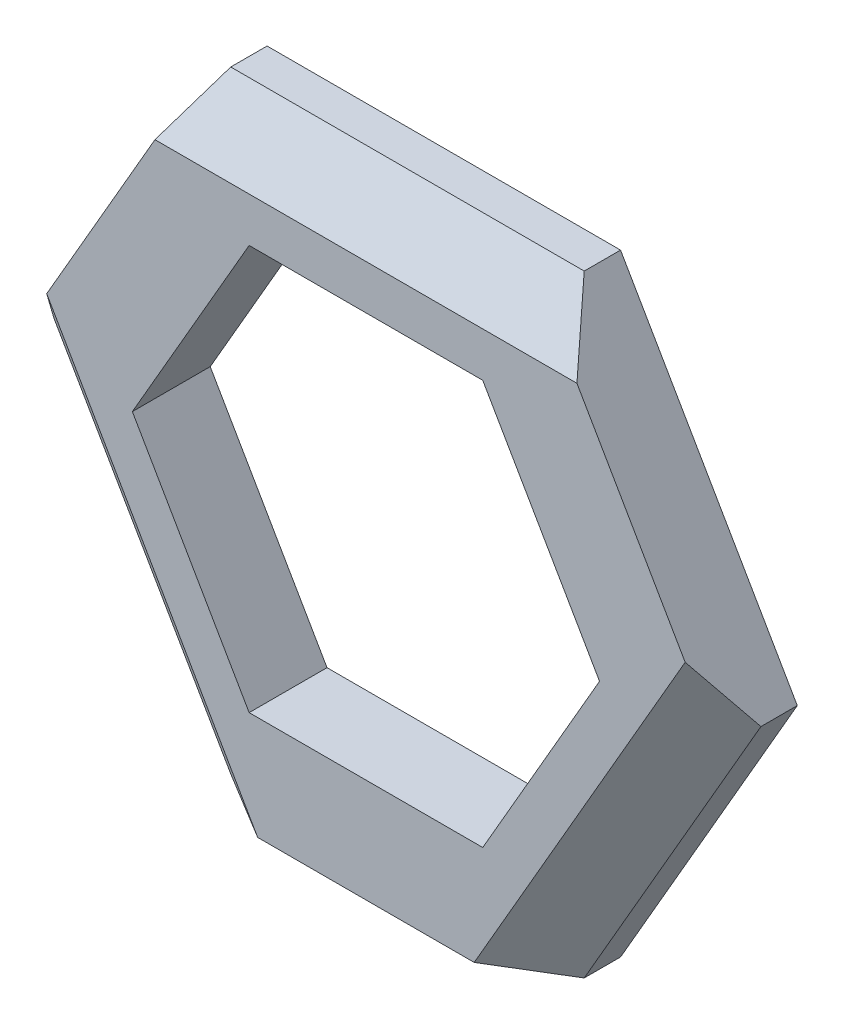
ISO-10303-21;
HEADER;
FILE_DESCRIPTION(('STEP AP214'),'2;1');
FILE_NAME('part.step','',(''),(''),'','','');
FILE_SCHEMA(('AUTOMOTIVE_DESIGN { 1 0 10303 214 1 1 1 1 }'));
ENDSEC;
DATA;
#1=APPLICATION_CONTEXT('core data for automotive mechanical design processes');
#2=APPLICATION_PROTOCOL_DEFINITION('international standard','automotive_design',2000,#1);
#3=PRODUCT_CONTEXT('',#1,'mechanical');
#4=PRODUCT('Part','Part','',(#3));
#5=PRODUCT_RELATED_PRODUCT_CATEGORY('part','',(#4));
#6=PRODUCT_DEFINITION_FORMATION('','',#4);
#7=PRODUCT_DEFINITION_CONTEXT('part definition',#1,'design');
#8=PRODUCT_DEFINITION('design','',#6,#7);
#9=PRODUCT_DEFINITION_SHAPE('','',#8);
#10=(LENGTH_UNIT() NAMED_UNIT(*) SI_UNIT(.MILLI.,.METRE.));
#11=(NAMED_UNIT(*) PLANE_ANGLE_UNIT() SI_UNIT($,.RADIAN.));
#12=(NAMED_UNIT(*) SI_UNIT($,.STERADIAN.) SOLID_ANGLE_UNIT());
#13=UNCERTAINTY_MEASURE_WITH_UNIT(LENGTH_MEASURE(1.E-05),#10,'distance_accuracy_value','');
#14=(GEOMETRIC_REPRESENTATION_CONTEXT(3) GLOBAL_UNCERTAINTY_ASSIGNED_CONTEXT((#13)) GLOBAL_UNIT_ASSIGNED_CONTEXT((#10,
#11,#12)) REPRESENTATION_CONTEXT('',''));
#15=CARTESIAN_POINT('',(0.,0.,0.));
#16=DIRECTION('',(0.,0.,1.));
#17=DIRECTION('',(1.,0.,0.));
#18=AXIS2_PLACEMENT_3D('',#15,#16,#17);
#19=CARTESIAN_POINT('',(0.,0.,15.));
#20=DIRECTION('',(0.,0.,1.));
#21=DIRECTION('',(1.,0.,0.));
#22=AXIS2_PLACEMENT_3D('',#19,#20,#21);
#23=PLANE('',#22);
#24=DIRECTION('',(-0.499999999999999,-0.866025403784439,0.));
#25=VECTOR('',#24,1.);
#26=CARTESIAN_POINT('',(-34.0470053837925,58.9711431702997,15.));
#27=LINE('',#26,#25);
#28=CARTESIAN_POINT('',(-40.643338472874,47.5459591163628,15.));
#29=VERTEX_POINT('',#28);
#30=CARTESIAN_POINT('',(-61.4976776785035,11.4251840539368,15.));
#31=VERTEX_POINT('',#30);
#32=EDGE_CURVE('E199',#29,#31,#27,.T.);
#33=ORIENTED_EDGE('',*,*,#32,.T.);
#34=DIRECTION('',(0.500000000000001,-0.866025403784438,0.));
#35=VECTOR('',#34,1.);
#36=CARTESIAN_POINT('',(-24.1525057501702,-53.2585511433313,15.));
#37=LINE('',#36,#35);
#38=CARTESIAN_POINT('',(-20.8543392056294,-58.9711431702998,15.));
#39=VERTEX_POINT('',#38);
#40=EDGE_CURVE('E240',#31,#39,#37,.T.);
#41=ORIENTED_EDGE('',*,*,#40,.T.);
#42=DIRECTION('',(1.,0.,0.));
#43=VECTOR('',#42,1.);
#44=CARTESIAN_POINT('',(-34.0470053837924,-58.9711431702998,15.));
#45=LINE('',#44,#43);
#46=CARTESIAN_POINT('',(20.8543392056295,-58.9711431702998,15.));
#47=VERTEX_POINT('',#46);
#48=EDGE_CURVE('E203',#39,#47,#45,.T.);
#49=ORIENTED_EDGE('',*,*,#48,.T.);
#50=DIRECTION('',(0.499999999999998,0.86602540378444,0.));
#51=VECTOR('',#50,1.);
#52=CARTESIAN_POINT('',(58.1995111339627,5.71259202696859,15.));
#53=LINE('',#52,#51);
#54=CARTESIAN_POINT('',(61.4976776785034,11.4251840539371,15.));
#55=VERTEX_POINT('',#54);
#56=EDGE_CURVE('E237',#47,#55,#53,.T.);
#57=ORIENTED_EDGE('',*,*,#56,.T.);
#58=DIRECTION('',(-0.500000000000001,0.866025403784438,0.));
#59=VECTOR('',#58,1.);
#60=CARTESIAN_POINT('',(68.094010767585,1.21968236504704E-13,15.));
#61=LINE('',#60,#59);
#62=CARTESIAN_POINT('',(40.643338472874,47.5459591163628,15.));
#63=VERTEX_POINT('',#62);
#64=EDGE_CURVE('E196',#55,#63,#61,.T.);
#65=ORIENTED_EDGE('',*,*,#64,.T.);
#66=DIRECTION('',(-1.,0.,0.));
#67=VECTOR('',#66,1.);
#68=CARTESIAN_POINT('',(-34.0470053837925,47.5459591163628,15.));
#69=LINE('',#68,#67);
#70=EDGE_CURVE('E234',#63,#29,#69,.T.);
#71=ORIENTED_EDGE('',*,*,#70,.T.);
#72=EDGE_LOOP('',(#33,#41,#49,#57,#65,#71));
#73=FACE_BOUND('',#72,.T.);
#74=DIRECTION('',(-0.500000000000001,0.866025403784438,0.));
#75=VECTOR('',#74,1.);
#76=CARTESIAN_POINT('',(45.,0.,15.));
#77=LINE('',#76,#75);
#78=CARTESIAN_POINT('',(45.,0.,15.));
#79=VERTEX_POINT('',#78);
#80=CARTESIAN_POINT('',(22.5,38.9711431702997,15.));
#81=VERTEX_POINT('',#80);
#82=EDGE_CURVE('E150',#79,#81,#77,.T.);
#83=ORIENTED_EDGE('',*,*,#82,.F.);
#84=DIRECTION('',(0.499999999999999,0.866025403784439,0.));
#85=VECTOR('',#84,1.);
#86=CARTESIAN_POINT('',(22.5,-38.9711431702998,15.));
#87=LINE('',#86,#85);
#88=CARTESIAN_POINT('',(22.5,-38.9711431702998,15.));
#89=VERTEX_POINT('',#88);
#90=EDGE_CURVE('E140',#89,#79,#87,.T.);
#91=ORIENTED_EDGE('',*,*,#90,.F.);
#92=DIRECTION('',(1.,0.,0.));
#93=VECTOR('',#92,1.);
#94=CARTESIAN_POINT('',(-22.4999999999999,-38.9711431702998,15.));
#95=LINE('',#94,#93);
#96=CARTESIAN_POINT('',(-22.4999999999999,-38.9711431702998,15.));
#97=VERTEX_POINT('',#96);
#98=EDGE_CURVE('E172',#97,#89,#95,.T.);
#99=ORIENTED_EDGE('',*,*,#98,.F.);
#100=DIRECTION('',(0.500000000000001,-0.866025403784438,0.));
#101=VECTOR('',#100,1.);
#102=CARTESIAN_POINT('',(-44.9999999999999,0.,15.));
#103=LINE('',#102,#101);
#104=CARTESIAN_POINT('',(-44.9999999999999,0.,15.));
#105=VERTEX_POINT('',#104);
#106=EDGE_CURVE('E169',#105,#97,#103,.T.);
#107=ORIENTED_EDGE('',*,*,#106,.F.);
#108=DIRECTION('',(-0.499999999999999,-0.866025403784439,0.));
#109=VECTOR('',#108,1.);
#110=CARTESIAN_POINT('',(-22.5,38.9711431702997,15.));
#111=LINE('',#110,#109);
#112=CARTESIAN_POINT('',(-22.5,38.9711431702997,15.));
#113=VERTEX_POINT('',#112);
#114=EDGE_CURVE('E165',#113,#105,#111,.T.);
#115=ORIENTED_EDGE('',*,*,#114,.F.);
#116=DIRECTION('',(-1.,0.,0.));
#117=VECTOR('',#116,1.);
#118=CARTESIAN_POINT('',(22.5,38.9711431702997,15.));
#119=LINE('',#118,#117);
#120=EDGE_CURVE('E163',#81,#113,#119,.T.);
#121=ORIENTED_EDGE('',*,*,#120,.F.);
#122=EDGE_LOOP('',(#83,#91,#99,#107,#115,#121));
#123=FACE_BOUND('',#122,.T.);
#124=ADVANCED_FACE('F33',(#73,#123),#23,.T.);
#125=CARTESIAN_POINT('',(0.,0.,0.));
#126=DIRECTION('',(0.,0.,1.));
#127=DIRECTION('',(1.,0.,0.));
#128=AXIS2_PLACEMENT_3D('',#125,#126,#127);
#129=PLANE('',#128);
#130=DIRECTION('',(-0.500000000000001,0.866025403784438,0.));
#131=VECTOR('',#130,1.);
#132=CARTESIAN_POINT('',(68.094010767585,1.21968236504704E-13,0.));
#133=LINE('',#132,#131);
#134=CARTESIAN_POINT('',(68.094010767585,1.21968236504704E-13,0.));
#135=VERTEX_POINT('',#134);
#136=CARTESIAN_POINT('',(34.0470053837925,58.9711431702997,0.));
#137=VERTEX_POINT('',#136);
#138=EDGE_CURVE('E158',#135,#137,#133,.T.);
#139=ORIENTED_EDGE('',*,*,#138,.F.);
#140=DIRECTION('',(0.499999999999998,0.86602540378444,0.));
#141=VECTOR('',#140,1.);
#142=CARTESIAN_POINT('',(34.0470053837925,-58.9711431702998,0.));
#143=LINE('',#142,#141);
#144=CARTESIAN_POINT('',(34.0470053837925,-58.9711431702998,0.));
#145=VERTEX_POINT('',#144);
#146=EDGE_CURVE('E200',#145,#135,#143,.T.);
#147=ORIENTED_EDGE('',*,*,#146,.F.);
#148=DIRECTION('',(1.,0.,0.));
#149=VECTOR('',#148,1.);
#150=CARTESIAN_POINT('',(-34.0470053837924,-58.9711431702998,0.));
#151=LINE('',#150,#149);
#152=CARTESIAN_POINT('',(-34.0470053837924,-58.9711431702998,0.));
#153=VERTEX_POINT('',#152);
#154=EDGE_CURVE('E218',#153,#145,#151,.T.);
#155=ORIENTED_EDGE('',*,*,#154,.F.);
#156=DIRECTION('',(0.500000000000001,-0.866025403784438,0.));
#157=VECTOR('',#156,1.);
#158=CARTESIAN_POINT('',(-68.094010767585,-1.17887349479437E-13,0.));
#159=LINE('',#158,#157);
#160=CARTESIAN_POINT('',(-68.094010767585,-1.17887349479437E-13,0.));
#161=VERTEX_POINT('',#160);
#162=EDGE_CURVE('E215',#161,#153,#159,.T.);
#163=ORIENTED_EDGE('',*,*,#162,.F.);
#164=DIRECTION('',(-0.499999999999999,-0.866025403784439,0.));
#165=VECTOR('',#164,1.);
#166=CARTESIAN_POINT('',(-34.0470053837925,58.9711431702997,0.));
#167=LINE('',#166,#165);
#168=CARTESIAN_POINT('',(-34.0470053837925,58.9711431702997,0.));
#169=VERTEX_POINT('',#168);
#170=EDGE_CURVE('E212',#169,#161,#167,.T.);
#171=ORIENTED_EDGE('',*,*,#170,.F.);
#172=DIRECTION('',(-1.,0.,0.));
#173=VECTOR('',#172,1.);
#174=CARTESIAN_POINT('',(34.0470053837925,58.9711431702997,0.));
#175=LINE('',#174,#173);
#176=EDGE_CURVE('E209',#137,#169,#175,.T.);
#177=ORIENTED_EDGE('',*,*,#176,.F.);
#178=EDGE_LOOP('',(#139,#147,#155,#163,#171,#177));
#179=FACE_BOUND('',#178,.T.);
#180=DIRECTION('',(0.499999999999999,0.866025403784439,0.));
#181=VECTOR('',#180,1.);
#182=CARTESIAN_POINT('',(22.5,-38.9711431702998,0.));
#183=LINE('',#182,#181);
#184=CARTESIAN_POINT('',(22.5,-38.9711431702998,0.));
#185=VERTEX_POINT('',#184);
#186=CARTESIAN_POINT('',(45.,0.,0.));
#187=VERTEX_POINT('',#186);
#188=EDGE_CURVE('E174',#185,#187,#183,.T.);
#189=ORIENTED_EDGE('',*,*,#188,.T.);
#190=DIRECTION('',(-0.500000000000001,0.866025403784438,0.));
#191=VECTOR('',#190,1.);
#192=CARTESIAN_POINT('',(45.,0.,0.));
#193=LINE('',#192,#191);
#194=CARTESIAN_POINT('',(22.5,38.9711431702997,0.));
#195=VERTEX_POINT('',#194);
#196=EDGE_CURVE('E157',#187,#195,#193,.T.);
#197=ORIENTED_EDGE('',*,*,#196,.T.);
#198=DIRECTION('',(-1.,0.,0.));
#199=VECTOR('',#198,1.);
#200=CARTESIAN_POINT('',(22.5,38.9711431702997,0.));
#201=LINE('',#200,#199);
#202=CARTESIAN_POINT('',(-22.5,38.9711431702997,0.));
#203=VERTEX_POINT('',#202);
#204=EDGE_CURVE('E177',#195,#203,#201,.T.);
#205=ORIENTED_EDGE('',*,*,#204,.T.);
#206=DIRECTION('',(-0.499999999999999,-0.866025403784439,0.));
#207=VECTOR('',#206,1.);
#208=CARTESIAN_POINT('',(-22.5,38.9711431702997,0.));
#209=LINE('',#208,#207);
#210=CARTESIAN_POINT('',(-44.9999999999999,0.,0.));
#211=VERTEX_POINT('',#210);
#212=EDGE_CURVE('E180',#203,#211,#209,.T.);
#213=ORIENTED_EDGE('',*,*,#212,.T.);
#214=DIRECTION('',(0.500000000000001,-0.866025403784438,0.));
#215=VECTOR('',#214,1.);
#216=CARTESIAN_POINT('',(-44.9999999999999,0.,0.));
#217=LINE('',#216,#215);
#218=CARTESIAN_POINT('',(-22.4999999999999,-38.9711431702998,0.));
#219=VERTEX_POINT('',#218);
#220=EDGE_CURVE('E183',#211,#219,#217,.T.);
#221=ORIENTED_EDGE('',*,*,#220,.T.);
#222=DIRECTION('',(1.,0.,0.));
#223=VECTOR('',#222,1.);
#224=CARTESIAN_POINT('',(-22.4999999999999,-38.9711431702998,0.));
#225=LINE('',#224,#223);
#226=EDGE_CURVE('E151',#219,#185,#225,.T.);
#227=ORIENTED_EDGE('',*,*,#226,.T.);
#228=EDGE_LOOP('',(#189,#197,#205,#213,#221,#227));
#229=FACE_BOUND('',#228,.T.);
#230=ADVANCED_FACE('F289',(#179,#229),#129,.F.);
#231=CARTESIAN_POINT('',(68.094010767585,1.21968236504704E-13,15.));
#232=DIRECTION('',(-0.866025403784438,-0.500000000000001,0.));
#233=DIRECTION('',(0.500000000000001,-0.866025403784438,0.));
#234=AXIS2_PLACEMENT_3D('',#231,#232,#233);
#235=PLANE('',#234);
#236=ORIENTED_EDGE('',*,*,#64,.F.);
#237=DIRECTION('',(0.427535056636438,-0.740512440111146,-0.518512392703891));
#238=VECTOR('',#237,1.);
#239=CARTESIAN_POINT('',(68.9267200752591,-1.4422948288269,5.99009428853439));
#240=LINE('',#239,#238);
#241=CARTESIAN_POINT('',(68.094010767585,1.21968236504704E-13,6.99999999999995));
#242=VERTEX_POINT('',#241);
#243=EDGE_CURVE('E48',#55,#242,#240,.T.);
#244=ORIENTED_EDGE('',*,*,#243,.T.);
#245=DIRECTION('',(0.,0.,-1.));
#246=VECTOR('',#245,1.);
#247=CARTESIAN_POINT('',(68.094010767585,1.21968236504704E-13,15.));
#248=LINE('',#247,#246);
#249=EDGE_CURVE('E206',#242,#135,#248,.T.);
#250=ORIENTED_EDGE('',*,*,#249,.T.);
#251=ORIENTED_EDGE('',*,*,#138,.T.);
#252=DIRECTION('',(0.,0.,-1.));
#253=VECTOR('',#252,1.);
#254=CARTESIAN_POINT('',(34.0470053837925,58.9711431702997,15.));
#255=LINE('',#254,#253);
#256=CARTESIAN_POINT('',(34.0470053837925,58.9711431702997,6.99999999999999));
#257=VERTEX_POINT('',#256);
#258=EDGE_CURVE('E232',#257,#137,#255,.T.);
#259=ORIENTED_EDGE('',*,*,#258,.F.);
#260=DIRECTION('',(0.427535056636437,-0.740512440111146,0.518512392703892));
#261=VECTOR('',#260,1.);
#262=CARTESIAN_POINT('',(33.2142960761184,60.4134379991268,5.99009428853439));
#263=LINE('',#262,#261);
#264=EDGE_CURVE('E253',#257,#63,#263,.T.);
#265=ORIENTED_EDGE('',*,*,#264,.T.);
#266=EDGE_LOOP('',(#236,#244,#250,#251,#259,#265));
#267=FACE_BOUND('',#266,.T.);
#268=ADVANCED_FACE('F270',(#267),#235,.F.);
#269=CARTESIAN_POINT('',(34.0470053837925,58.9711431702997,15.));
#270=DIRECTION('',(0.,-1.,0.));
#271=DIRECTION('',(0.,0.,-1.));
#272=AXIS2_PLACEMENT_3D('',#269,#270,#271);
#273=PLANE('',#272);
#274=DIRECTION('',(0.,0.,-1.));
#275=VECTOR('',#274,1.);
#276=CARTESIAN_POINT('',(-34.0470053837925,58.9711431702997,15.));
#277=LINE('',#276,#275);
#278=CARTESIAN_POINT('',(-34.0470053837925,58.9711431702997,6.99999999999999));
#279=VERTEX_POINT('',#278);
#280=EDGE_CURVE('E230',#279,#169,#277,.T.);
#281=ORIENTED_EDGE('',*,*,#280,.F.);
#282=DIRECTION('',(1.,0.,0.));
#283=VECTOR('',#282,1.);
#284=CARTESIAN_POINT('',(34.0470053837925,58.9711431702997,6.99999999999999));
#285=LINE('',#284,#283);
#286=EDGE_CURVE('E11',#279,#257,#285,.T.);
#287=ORIENTED_EDGE('',*,*,#286,.T.);
#288=ORIENTED_EDGE('',*,*,#258,.T.);
#289=ORIENTED_EDGE('',*,*,#176,.T.);
#290=EDGE_LOOP('',(#281,#287,#288,#289));
#291=FACE_BOUND('',#290,.T.);
#292=ADVANCED_FACE('F292',(#291),#273,.F.);
#293=CARTESIAN_POINT('',(-34.0470053837925,58.9711431702997,15.));
#294=DIRECTION('',(0.866025403784439,-0.499999999999999,0.));
#295=DIRECTION('',(0.499999999999999,0.86602540378444,0.));
#296=AXIS2_PLACEMENT_3D('',#293,#294,#295);
#297=PLANE('',#296);
#298=DIRECTION('',(0.,0.,-1.));
#299=VECTOR('',#298,1.);
#300=CARTESIAN_POINT('',(-68.094010767585,-1.17887349479437E-13,15.));
#301=LINE('',#300,#299);
#302=CARTESIAN_POINT('',(-68.094010767585,-1.17887349479437E-13,6.99999999999999));
#303=VERTEX_POINT('',#302);
#304=EDGE_CURVE('E228',#303,#161,#301,.T.);
#305=ORIENTED_EDGE('',*,*,#304,.F.);
#306=DIRECTION('',(0.427535056636436,0.740512440111147,0.518512392703892));
#307=VECTOR('',#306,1.);
#308=CARTESIAN_POINT('',(-68.9267200752591,-1.44229482882717,5.99009428853441));
#309=LINE('',#308,#307);
#310=EDGE_CURVE('E251',#303,#31,#309,.T.);
#311=ORIENTED_EDGE('',*,*,#310,.T.);
#312=ORIENTED_EDGE('',*,*,#32,.F.);
#313=DIRECTION('',(0.427535056636435,0.740512440111146,-0.518512392703893));
#314=VECTOR('',#313,1.);
#315=CARTESIAN_POINT('',(-33.2142960761185,60.4134379991267,5.99009428853442));
#316=LINE('',#315,#314);
#317=EDGE_CURVE('E249',#29,#279,#316,.T.);
#318=ORIENTED_EDGE('',*,*,#317,.T.);
#319=ORIENTED_EDGE('',*,*,#280,.T.);
#320=ORIENTED_EDGE('',*,*,#170,.T.);
#321=EDGE_LOOP('',(#305,#311,#312,#318,#319,#320));
#322=FACE_BOUND('',#321,.T.);
#323=ADVANCED_FACE('F277',(#322),#297,.F.);
#324=CARTESIAN_POINT('',(-68.094010767585,-1.17887349479437E-13,15.));
#325=DIRECTION('',(0.866025403784438,0.500000000000001,0.));
#326=DIRECTION('',(-0.500000000000001,0.866025403784438,0.));
#327=AXIS2_PLACEMENT_3D('',#324,#325,#326);
#328=PLANE('',#327);
#329=DIRECTION('',(0.,0.,-1.));
#330=VECTOR('',#329,1.);
#331=CARTESIAN_POINT('',(-34.0470053837924,-58.9711431702998,15.));
#332=LINE('',#331,#330);
#333=CARTESIAN_POINT('',(-34.0470053837924,-58.9711431702998,6.99999999999999));
#334=VERTEX_POINT('',#333);
#335=EDGE_CURVE('E226',#334,#153,#332,.T.);
#336=ORIENTED_EDGE('',*,*,#335,.F.);
#337=DIRECTION('',(-0.500000000000001,0.866025403784438,0.));
#338=VECTOR('',#337,1.);
#339=CARTESIAN_POINT('',(-68.094010767585,-1.16641692037694E-13,6.99999999999999));
#340=LINE('',#339,#338);
#341=EDGE_CURVE('E247',#334,#303,#340,.T.);
#342=ORIENTED_EDGE('',*,*,#341,.T.);
#343=ORIENTED_EDGE('',*,*,#304,.T.);
#344=ORIENTED_EDGE('',*,*,#162,.T.);
#345=EDGE_LOOP('',(#336,#342,#343,#344));
#346=FACE_BOUND('',#345,.T.);
#347=ADVANCED_FACE('F284',(#346),#328,.F.);
#348=CARTESIAN_POINT('',(-34.0470053837924,-58.9711431702998,15.));
#349=DIRECTION('',(0.,1.,0.));
#350=DIRECTION('',(0.,0.,1.));
#351=AXIS2_PLACEMENT_3D('',#348,#349,#350);
#352=PLANE('',#351);
#353=ORIENTED_EDGE('',*,*,#48,.F.);
#354=DIRECTION('',(-0.855070113272874,0.,-0.518512392703892));
#355=VECTOR('',#354,1.);
#356=CARTESIAN_POINT('',(-35.7124239991407,-58.9711431702998,5.99009428853438));
#357=LINE('',#356,#355);
#358=EDGE_CURVE('E245',#39,#334,#357,.T.);
#359=ORIENTED_EDGE('',*,*,#358,.T.);
#360=ORIENTED_EDGE('',*,*,#335,.T.);
#361=ORIENTED_EDGE('',*,*,#154,.T.);
#362=DIRECTION('',(0.,0.,-1.));
#363=VECTOR('',#362,1.);
#364=CARTESIAN_POINT('',(34.0470053837925,-58.9711431702998,15.));
#365=LINE('',#364,#363);
#366=CARTESIAN_POINT('',(34.0470053837925,-58.9711431702998,6.99999999999995));
#367=VERTEX_POINT('',#366);
#368=EDGE_CURVE('E224',#367,#145,#365,.T.);
#369=ORIENTED_EDGE('',*,*,#368,.F.);
#370=DIRECTION('',(-0.855070113272874,0.,0.518512392703892));
#371=VECTOR('',#370,1.);
#372=CARTESIAN_POINT('',(35.7124239991407,-58.9711431702998,5.9900942885344));
#373=LINE('',#372,#371);
#374=EDGE_CURVE('E243',#367,#47,#373,.T.);
#375=ORIENTED_EDGE('',*,*,#374,.T.);
#376=EDGE_LOOP('',(#353,#359,#360,#361,#369,#375));
#377=FACE_BOUND('',#376,.T.);
#378=ADVANCED_FACE('F263',(#377),#352,.F.);
#379=CARTESIAN_POINT('',(34.0470053837925,-58.9711431702998,15.));
#380=DIRECTION('',(-0.86602540378444,0.499999999999998,0.));
#381=DIRECTION('',(-0.499999999999998,-0.86602540378444,0.));
#382=AXIS2_PLACEMENT_3D('',#379,#380,#381);
#383=PLANE('',#382);
#384=ORIENTED_EDGE('',*,*,#249,.F.);
#385=DIRECTION('',(-0.499999999999998,-0.86602540378444,0.));
#386=VECTOR('',#385,1.);
#387=CARTESIAN_POINT('',(34.0470053837925,-58.9711431702998,6.99999999999995));
#388=LINE('',#387,#386);
#389=EDGE_CURVE('E41',#242,#367,#388,.T.);
#390=ORIENTED_EDGE('',*,*,#389,.T.);
#391=ORIENTED_EDGE('',*,*,#368,.T.);
#392=ORIENTED_EDGE('',*,*,#146,.T.);
#393=EDGE_LOOP('',(#384,#390,#391,#392));
#394=FACE_BOUND('',#393,.T.);
#395=ADVANCED_FACE('F258',(#394),#383,.F.);
#396=CARTESIAN_POINT('',(22.5,-38.9711431702998,15.));
#397=DIRECTION('',(-0.866025403784439,0.499999999999999,0.));
#398=DIRECTION('',(-0.499999999999999,-0.866025403784439,0.));
#399=AXIS2_PLACEMENT_3D('',#396,#397,#398);
#400=PLANE('',#399);
#401=ORIENTED_EDGE('',*,*,#188,.F.);
#402=DIRECTION('',(0.,0.,-1.));
#403=VECTOR('',#402,1.);
#404=CARTESIAN_POINT('',(22.5,-38.9711431702998,15.));
#405=LINE('',#404,#403);
#406=EDGE_CURVE('E146',#89,#185,#405,.T.);
#407=ORIENTED_EDGE('',*,*,#406,.F.);
#408=ORIENTED_EDGE('',*,*,#90,.T.);
#409=DIRECTION('',(0.,0.,-1.));
#410=VECTOR('',#409,1.);
#411=CARTESIAN_POINT('',(45.,0.,15.));
#412=LINE('',#411,#410);
#413=EDGE_CURVE('E143',#79,#187,#412,.T.);
#414=ORIENTED_EDGE('',*,*,#413,.T.);
#415=EDGE_LOOP('',(#401,#407,#408,#414));
#416=FACE_BOUND('',#415,.T.);
#417=ADVANCED_FACE('F142',(#416),#400,.T.);
#418=CARTESIAN_POINT('',(45.,0.,15.));
#419=DIRECTION('',(-0.866025403784438,-0.500000000000001,0.));
#420=DIRECTION('',(0.500000000000001,-0.866025403784438,0.));
#421=AXIS2_PLACEMENT_3D('',#418,#419,#420);
#422=PLANE('',#421);
#423=ORIENTED_EDGE('',*,*,#196,.F.);
#424=ORIENTED_EDGE('',*,*,#413,.F.);
#425=ORIENTED_EDGE('',*,*,#82,.T.);
#426=DIRECTION('',(0.,0.,-1.));
#427=VECTOR('',#426,1.);
#428=CARTESIAN_POINT('',(22.5,38.9711431702997,15.));
#429=LINE('',#428,#427);
#430=EDGE_CURVE('E159',#81,#195,#429,.T.);
#431=ORIENTED_EDGE('',*,*,#430,.T.);
#432=EDGE_LOOP('',(#423,#424,#425,#431));
#433=FACE_BOUND('',#432,.T.);
#434=ADVANCED_FACE('F154',(#433),#422,.T.);
#435=CARTESIAN_POINT('',(22.5,38.9711431702997,15.));
#436=DIRECTION('',(0.,-1.,0.));
#437=DIRECTION('',(0.,0.,-1.));
#438=AXIS2_PLACEMENT_3D('',#435,#436,#437);
#439=PLANE('',#438);
#440=ORIENTED_EDGE('',*,*,#204,.F.);
#441=ORIENTED_EDGE('',*,*,#430,.F.);
#442=ORIENTED_EDGE('',*,*,#120,.T.);
#443=DIRECTION('',(0.,0.,-1.));
#444=VECTOR('',#443,1.);
#445=CARTESIAN_POINT('',(-22.5,38.9711431702997,15.));
#446=LINE('',#445,#444);
#447=EDGE_CURVE('E193',#113,#203,#446,.T.);
#448=ORIENTED_EDGE('',*,*,#447,.T.);
#449=EDGE_LOOP('',(#440,#441,#442,#448));
#450=FACE_BOUND('',#449,.T.);
#451=ADVANCED_FACE('F340',(#450),#439,.T.);
#452=CARTESIAN_POINT('',(-22.5,38.9711431702997,15.));
#453=DIRECTION('',(0.866025403784439,-0.499999999999999,0.));
#454=DIRECTION('',(0.499999999999999,0.86602540378444,0.));
#455=AXIS2_PLACEMENT_3D('',#452,#453,#454);
#456=PLANE('',#455);
#457=ORIENTED_EDGE('',*,*,#212,.F.);
#458=ORIENTED_EDGE('',*,*,#447,.F.);
#459=ORIENTED_EDGE('',*,*,#114,.T.);
#460=DIRECTION('',(0.,0.,-1.));
#461=VECTOR('',#460,1.);
#462=CARTESIAN_POINT('',(-44.9999999999999,0.,15.));
#463=LINE('',#462,#461);
#464=EDGE_CURVE('E191',#105,#211,#463,.T.);
#465=ORIENTED_EDGE('',*,*,#464,.T.);
#466=EDGE_LOOP('',(#457,#458,#459,#465));
#467=FACE_BOUND('',#466,.T.);
#468=ADVANCED_FACE('F346',(#467),#456,.T.);
#469=CARTESIAN_POINT('',(-44.9999999999999,0.,15.));
#470=DIRECTION('',(0.866025403784438,0.500000000000001,0.));
#471=DIRECTION('',(-0.500000000000001,0.866025403784438,0.));
#472=AXIS2_PLACEMENT_3D('',#469,#470,#471);
#473=PLANE('',#472);
#474=ORIENTED_EDGE('',*,*,#220,.F.);
#475=ORIENTED_EDGE('',*,*,#464,.F.);
#476=ORIENTED_EDGE('',*,*,#106,.T.);
#477=DIRECTION('',(0.,0.,-1.));
#478=VECTOR('',#477,1.);
#479=CARTESIAN_POINT('',(-22.4999999999999,-38.9711431702998,15.));
#480=LINE('',#479,#478);
#481=EDGE_CURVE('E189',#97,#219,#480,.T.);
#482=ORIENTED_EDGE('',*,*,#481,.T.);
#483=EDGE_LOOP('',(#474,#475,#476,#482));
#484=FACE_BOUND('',#483,.T.);
#485=ADVANCED_FACE('F354',(#484),#473,.T.);
#486=CARTESIAN_POINT('',(-22.4999999999999,-38.9711431702998,15.));
#487=DIRECTION('',(0.,1.,0.));
#488=DIRECTION('',(-1.,0.,0.));
#489=AXIS2_PLACEMENT_3D('',#486,#487,#488);
#490=PLANE('',#489);
#491=ORIENTED_EDGE('',*,*,#226,.F.);
#492=ORIENTED_EDGE('',*,*,#481,.F.);
#493=ORIENTED_EDGE('',*,*,#98,.T.);
#494=ORIENTED_EDGE('',*,*,#406,.T.);
#495=EDGE_LOOP('',(#491,#492,#493,#494));
#496=FACE_BOUND('',#495,.T.);
#497=ADVANCED_FACE('F362',(#496),#490,.T.);
#498=CARTESIAN_POINT('',(-41.1760084420665,-23.7729795581815,15.));
#499=DIRECTION('',(-0.496731764892155,-0.286788218175524,0.819152044288991));
#500=DIRECTION('',(-0.500000000000001,0.866025403784438,0.));
#501=AXIS2_PLACEMENT_3D('',#498,#499,#500);
#502=PLANE('',#501);
#503=ORIENTED_EDGE('',*,*,#310,.F.);
#504=ORIENTED_EDGE('',*,*,#341,.F.);
#505=ORIENTED_EDGE('',*,*,#358,.F.);
#506=ORIENTED_EDGE('',*,*,#40,.F.);
#507=EDGE_LOOP('',(#503,#504,#505,#506));
#508=FACE_BOUND('',#507,.T.);
#509=ADVANCED_FACE('F281',(#508),#502,.T.);
#510=CARTESIAN_POINT('',(41.1760084420665,-23.7729795581813,15.));
#511=DIRECTION('',(0.496731764892155,-0.286788218175522,0.819152044288992));
#512=DIRECTION('',(-0.499999999999998,-0.86602540378444,0.));
#513=AXIS2_PLACEMENT_3D('',#510,#511,#512);
#514=PLANE('',#513);
#515=ORIENTED_EDGE('',*,*,#374,.F.);
#516=ORIENTED_EDGE('',*,*,#389,.F.);
#517=ORIENTED_EDGE('',*,*,#243,.F.);
#518=ORIENTED_EDGE('',*,*,#56,.F.);
#519=EDGE_LOOP('',(#515,#516,#517,#518));
#520=FACE_BOUND('',#519,.T.);
#521=ADVANCED_FACE('F267',(#520),#514,.T.);
#522=CARTESIAN_POINT('',(0.,47.5459591163628,15.));
#523=DIRECTION('',(0.,0.573576436351047,0.819152044288991));
#524=DIRECTION('',(1.,0.,0.));
#525=AXIS2_PLACEMENT_3D('',#522,#523,#524);
#526=PLANE('',#525);
#527=ORIENTED_EDGE('',*,*,#264,.F.);
#528=ORIENTED_EDGE('',*,*,#286,.F.);
#529=ORIENTED_EDGE('',*,*,#317,.F.);
#530=ORIENTED_EDGE('',*,*,#70,.F.);
#531=EDGE_LOOP('',(#527,#528,#529,#530));
#532=FACE_BOUND('',#531,.T.);
#533=ADVANCED_FACE('F35',(#532),#526,.T.);
#534=CLOSED_SHELL('',(#124,#230,#268,#292,#323,#347,#378,#395,#417,#434,#451,#468,#485,#497,
#509,#521,#533));
#535=MANIFOLD_SOLID_BREP('B2',#534);
#536=ADVANCED_BREP_SHAPE_REPRESENTATION('',(#18,#535),#14);
#537=SHAPE_DEFINITION_REPRESENTATION(#9,#536);
ENDSEC;
END-ISO-10303-21;
